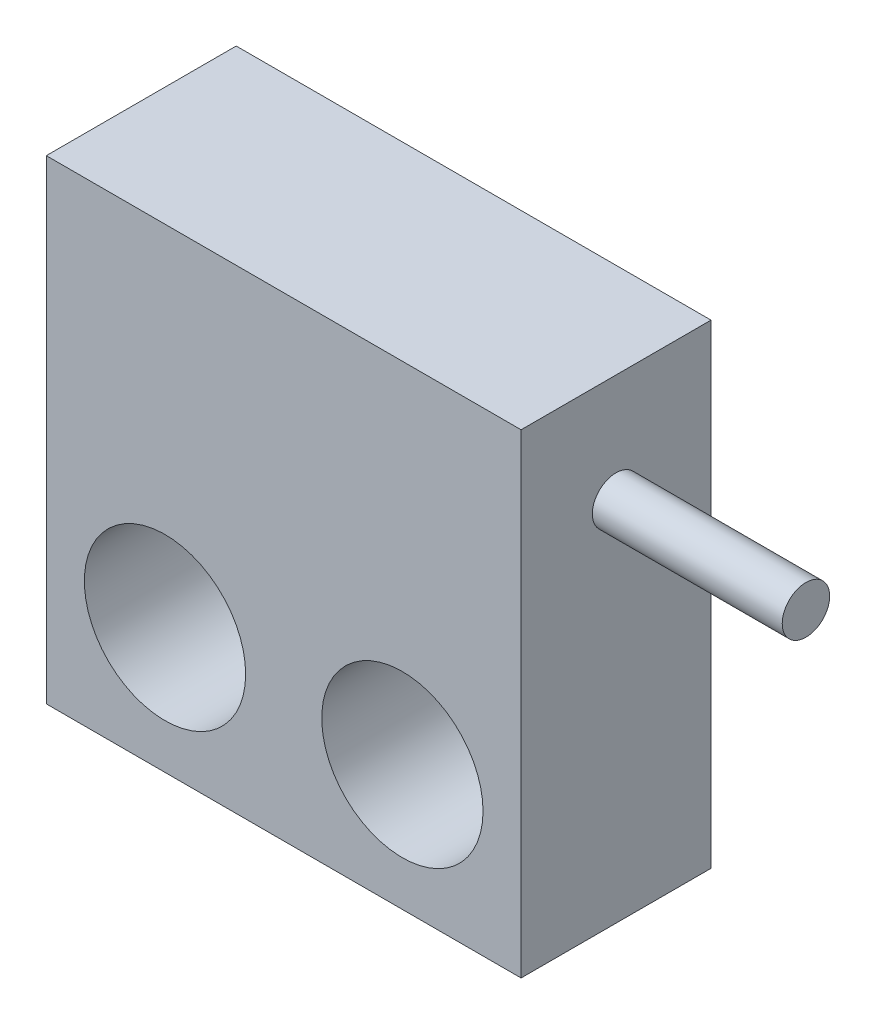
ISO-10303-21;
HEADER;
FILE_DESCRIPTION(('STEP AP214'),'2;1');
FILE_NAME('part.step','',(''),(''),'','','');
FILE_SCHEMA(('AUTOMOTIVE_DESIGN { 1 0 10303 214 1 1 1 1 }'));
ENDSEC;
DATA;
#1=APPLICATION_CONTEXT('core data for automotive mechanical design processes');
#2=APPLICATION_PROTOCOL_DEFINITION('international standard','automotive_design',2000,#1);
#3=PRODUCT_CONTEXT('',#1,'mechanical');
#4=PRODUCT('Part','Part','',(#3));
#5=PRODUCT_RELATED_PRODUCT_CATEGORY('part','',(#4));
#6=PRODUCT_DEFINITION_FORMATION('','',#4);
#7=PRODUCT_DEFINITION_CONTEXT('part definition',#1,'design');
#8=PRODUCT_DEFINITION('design','',#6,#7);
#9=PRODUCT_DEFINITION_SHAPE('','',#8);
#10=(LENGTH_UNIT() NAMED_UNIT(*) SI_UNIT(.MILLI.,.METRE.));
#11=(NAMED_UNIT(*) PLANE_ANGLE_UNIT() SI_UNIT($,.RADIAN.));
#12=(NAMED_UNIT(*) SI_UNIT($,.STERADIAN.) SOLID_ANGLE_UNIT());
#13=UNCERTAINTY_MEASURE_WITH_UNIT(LENGTH_MEASURE(1.E-05),#10,'distance_accuracy_value','');
#14=(GEOMETRIC_REPRESENTATION_CONTEXT(3) GLOBAL_UNCERTAINTY_ASSIGNED_CONTEXT((#13)) GLOBAL_UNIT_ASSIGNED_CONTEXT((#10,
#11,#12)) REPRESENTATION_CONTEXT('',''));
#15=CARTESIAN_POINT('',(0.,0.,0.));
#16=DIRECTION('',(0.,0.,1.));
#17=DIRECTION('',(1.,0.,0.));
#18=AXIS2_PLACEMENT_3D('',#15,#16,#17);
#19=CARTESIAN_POINT('',(0.,0.,20.));
#20=DIRECTION('',(0.,0.,-1.));
#21=DIRECTION('',(-1.,0.,0.));
#22=AXIS2_PLACEMENT_3D('',#19,#20,#21);
#23=PLANE('',#22);
#24=DIRECTION('',(0.,-1.,0.));
#25=VECTOR('',#24,1.);
#26=CARTESIAN_POINT('',(0.,0.,20.));
#27=LINE('',#26,#25);
#28=CARTESIAN_POINT('',(0.,50.,20.));
#29=VERTEX_POINT('',#28);
#30=CARTESIAN_POINT('',(0.,0.,20.));
#31=VERTEX_POINT('',#30);
#32=EDGE_CURVE('E90',#29,#31,#27,.T.);
#33=ORIENTED_EDGE('',*,*,#32,.T.);
#34=DIRECTION('',(1.,0.,0.));
#35=VECTOR('',#34,1.);
#36=CARTESIAN_POINT('',(0.,0.,20.));
#37=LINE('',#36,#35);
#38=CARTESIAN_POINT('',(50.,0.,20.));
#39=VERTEX_POINT('',#38);
#40=EDGE_CURVE('E85',#31,#39,#37,.T.);
#41=ORIENTED_EDGE('',*,*,#40,.T.);
#42=DIRECTION('',(0.,1.,0.));
#43=VECTOR('',#42,1.);
#44=CARTESIAN_POINT('',(50.,0.,20.));
#45=LINE('',#44,#43);
#46=CARTESIAN_POINT('',(50.,50.,20.));
#47=VERTEX_POINT('',#46);
#48=EDGE_CURVE('E88',#39,#47,#45,.T.);
#49=ORIENTED_EDGE('',*,*,#48,.T.);
#50=DIRECTION('',(-1.,0.,0.));
#51=VECTOR('',#50,1.);
#52=CARTESIAN_POINT('',(0.,50.,20.));
#53=LINE('',#52,#51);
#54=EDGE_CURVE('E54',#47,#29,#53,.T.);
#55=ORIENTED_EDGE('',*,*,#54,.T.);
#56=EDGE_LOOP('',(#33,#41,#49,#55));
#57=FACE_BOUND('',#56,.T.);
#58=CARTESIAN_POINT('',(12.5,13.2101831125864,20.));
#59=DIRECTION('',(0.,0.,1.));
#60=DIRECTION('',(1.,0.,0.));
#61=AXIS2_PLACEMENT_3D('',#58,#59,#60);
#62=CIRCLE('',#61,8.49319732259132);
#63=CARTESIAN_POINT('',(20.9931973225913,13.2101831125864,20.));
#64=VERTEX_POINT('',#63);
#65=EDGE_CURVE('E107',#64,#64,#62,.T.);
#66=ORIENTED_EDGE('',*,*,#65,.F.);
#67=EDGE_LOOP('',(#66));
#68=FACE_BOUND('',#67,.T.);
#69=CARTESIAN_POINT('',(37.5,13.2101831125864,20.));
#70=DIRECTION('',(0.,0.,1.));
#71=DIRECTION('',(1.,0.,0.));
#72=AXIS2_PLACEMENT_3D('',#69,#70,#71);
#73=CIRCLE('',#72,8.49319732259134);
#74=CARTESIAN_POINT('',(45.9931973225913,13.2101831125864,20.));
#75=VERTEX_POINT('',#74);
#76=EDGE_CURVE('E124',#75,#75,#73,.T.);
#77=ORIENTED_EDGE('',*,*,#76,.F.);
#78=EDGE_LOOP('',(#77));
#79=FACE_BOUND('',#78,.T.);
#80=ADVANCED_FACE('F37',(#57,#68,#79),#23,.F.);
#81=CARTESIAN_POINT('',(0.,0.,0.));
#82=DIRECTION('',(0.,0.,-1.));
#83=DIRECTION('',(-1.,0.,0.));
#84=AXIS2_PLACEMENT_3D('',#81,#82,#83);
#85=PLANE('',#84);
#86=CARTESIAN_POINT('',(12.5,13.2101831125864,0.));
#87=DIRECTION('',(0.,0.,1.));
#88=DIRECTION('',(1.,0.,0.));
#89=AXIS2_PLACEMENT_3D('',#86,#87,#88);
#90=CIRCLE('',#89,8.49319732259132);
#91=CARTESIAN_POINT('',(20.9931973225913,13.2101831125864,0.));
#92=VERTEX_POINT('',#91);
#93=EDGE_CURVE('E128',#92,#92,#90,.T.);
#94=ORIENTED_EDGE('',*,*,#93,.T.);
#95=EDGE_LOOP('',(#94));
#96=FACE_BOUND('',#95,.T.);
#97=DIRECTION('',(0.,-1.,0.));
#98=VECTOR('',#97,1.);
#99=CARTESIAN_POINT('',(0.,0.,0.));
#100=LINE('',#99,#98);
#101=CARTESIAN_POINT('',(0.,50.,0.));
#102=VERTEX_POINT('',#101);
#103=CARTESIAN_POINT('',(0.,0.,0.));
#104=VERTEX_POINT('',#103);
#105=EDGE_CURVE('E104',#102,#104,#100,.T.);
#106=ORIENTED_EDGE('',*,*,#105,.F.);
#107=DIRECTION('',(-1.,0.,0.));
#108=VECTOR('',#107,1.);
#109=CARTESIAN_POINT('',(0.,50.,0.));
#110=LINE('',#109,#108);
#111=CARTESIAN_POINT('',(50.,50.,0.));
#112=VERTEX_POINT('',#111);
#113=EDGE_CURVE('E77',#112,#102,#110,.T.);
#114=ORIENTED_EDGE('',*,*,#113,.F.);
#115=DIRECTION('',(0.,1.,0.));
#116=VECTOR('',#115,1.);
#117=CARTESIAN_POINT('',(50.,0.,0.));
#118=LINE('',#117,#116);
#119=CARTESIAN_POINT('',(50.,0.,0.));
#120=VERTEX_POINT('',#119);
#121=EDGE_CURVE('E71',#120,#112,#118,.T.);
#122=ORIENTED_EDGE('',*,*,#121,.F.);
#123=DIRECTION('',(1.,0.,0.));
#124=VECTOR('',#123,1.);
#125=CARTESIAN_POINT('',(0.,0.,0.));
#126=LINE('',#125,#124);
#127=EDGE_CURVE('E95',#104,#120,#126,.T.);
#128=ORIENTED_EDGE('',*,*,#127,.F.);
#129=EDGE_LOOP('',(#106,#114,#122,#128));
#130=FACE_BOUND('',#129,.T.);
#131=CARTESIAN_POINT('',(37.5,13.2101831125864,0.));
#132=DIRECTION('',(0.,0.,1.));
#133=DIRECTION('',(1.,0.,0.));
#134=AXIS2_PLACEMENT_3D('',#131,#132,#133);
#135=CIRCLE('',#134,8.49319732259134);
#136=CARTESIAN_POINT('',(45.9931973225913,13.2101831125864,0.));
#137=VERTEX_POINT('',#136);
#138=EDGE_CURVE('E122',#137,#137,#135,.T.);
#139=ORIENTED_EDGE('',*,*,#138,.T.);
#140=EDGE_LOOP('',(#139));
#141=FACE_BOUND('',#140,.T.);
#142=ADVANCED_FACE('F115',(#96,#130,#141),#85,.T.);
#143=CARTESIAN_POINT('',(0.,0.,20.));
#144=DIRECTION('',(1.,0.,0.));
#145=DIRECTION('',(0.,0.,-1.));
#146=AXIS2_PLACEMENT_3D('',#143,#144,#145);
#147=PLANE('',#146);
#148=ORIENTED_EDGE('',*,*,#105,.T.);
#149=DIRECTION('',(0.,0.,-1.));
#150=VECTOR('',#149,1.);
#151=CARTESIAN_POINT('',(0.,0.,20.));
#152=LINE('',#151,#150);
#153=EDGE_CURVE('E46',#31,#104,#152,.T.);
#154=ORIENTED_EDGE('',*,*,#153,.F.);
#155=ORIENTED_EDGE('',*,*,#32,.F.);
#156=DIRECTION('',(0.,0.,-1.));
#157=VECTOR('',#156,1.);
#158=CARTESIAN_POINT('',(0.,50.,20.));
#159=LINE('',#158,#157);
#160=EDGE_CURVE('E100',#29,#102,#159,.T.);
#161=ORIENTED_EDGE('',*,*,#160,.T.);
#162=EDGE_LOOP('',(#148,#154,#155,#161));
#163=FACE_BOUND('',#162,.T.);
#164=ADVANCED_FACE('F39',(#163),#147,.F.);
#165=CARTESIAN_POINT('',(0.,0.,20.));
#166=DIRECTION('',(0.,1.,0.));
#167=DIRECTION('',(0.,0.,1.));
#168=AXIS2_PLACEMENT_3D('',#165,#166,#167);
#169=PLANE('',#168);
#170=ORIENTED_EDGE('',*,*,#127,.T.);
#171=DIRECTION('',(0.,0.,-1.));
#172=VECTOR('',#171,1.);
#173=CARTESIAN_POINT('',(50.,0.,20.));
#174=LINE('',#173,#172);
#175=EDGE_CURVE('E93',#39,#120,#174,.T.);
#176=ORIENTED_EDGE('',*,*,#175,.F.);
#177=ORIENTED_EDGE('',*,*,#40,.F.);
#178=ORIENTED_EDGE('',*,*,#153,.T.);
#179=EDGE_LOOP('',(#170,#176,#177,#178));
#180=FACE_BOUND('',#179,.T.);
#181=ADVANCED_FACE('F94',(#180),#169,.F.);
#182=CARTESIAN_POINT('',(50.,0.,20.));
#183=DIRECTION('',(-1.,0.,0.));
#184=DIRECTION('',(0.,0.,1.));
#185=AXIS2_PLACEMENT_3D('',#182,#183,#184);
#186=PLANE('',#185);
#187=CARTESIAN_POINT('',(50.,38.5779585069408,10.));
#188=DIRECTION('',(-1.,0.,0.));
#189=DIRECTION('',(0.,0.,1.));
#190=AXIS2_PLACEMENT_3D('',#187,#188,#189);
#191=CIRCLE('',#190,2.5);
#192=CARTESIAN_POINT('',(50.,38.5779585069408,12.5));
#193=VERTEX_POINT('',#192);
#194=EDGE_CURVE('E11',#193,#193,#191,.F.);
#195=ORIENTED_EDGE('',*,*,#194,.F.);
#196=EDGE_LOOP('',(#195));
#197=FACE_BOUND('',#196,.T.);
#198=ORIENTED_EDGE('',*,*,#121,.T.);
#199=DIRECTION('',(0.,0.,-1.));
#200=VECTOR('',#199,1.);
#201=CARTESIAN_POINT('',(50.,50.,20.));
#202=LINE('',#201,#200);
#203=EDGE_CURVE('E96',#47,#112,#202,.T.);
#204=ORIENTED_EDGE('',*,*,#203,.F.);
#205=ORIENTED_EDGE('',*,*,#48,.F.);
#206=ORIENTED_EDGE('',*,*,#175,.T.);
#207=EDGE_LOOP('',(#198,#204,#205,#206));
#208=FACE_BOUND('',#207,.T.);
#209=ADVANCED_FACE('F98',(#197,#208),#186,.F.);
#210=CARTESIAN_POINT('',(0.,50.,20.));
#211=DIRECTION('',(0.,-1.,0.));
#212=DIRECTION('',(0.,0.,-1.));
#213=AXIS2_PLACEMENT_3D('',#210,#211,#212);
#214=PLANE('',#213);
#215=ORIENTED_EDGE('',*,*,#113,.T.);
#216=ORIENTED_EDGE('',*,*,#160,.F.);
#217=ORIENTED_EDGE('',*,*,#54,.F.);
#218=ORIENTED_EDGE('',*,*,#203,.T.);
#219=EDGE_LOOP('',(#215,#216,#217,#218));
#220=FACE_BOUND('',#219,.T.);
#221=ADVANCED_FACE('F141',(#220),#214,.F.);
#222=CARTESIAN_POINT('',(12.5,13.2101831125864,20.));
#223=DIRECTION('',(0.,0.,-1.));
#224=DIRECTION('',(-1.,0.,0.));
#225=AXIS2_PLACEMENT_3D('',#222,#223,#224);
#226=CYLINDRICAL_SURFACE('',#225,8.49319732259132);
#227=ORIENTED_EDGE('',*,*,#65,.T.);
#228=EDGE_LOOP('',(#227));
#229=FACE_BOUND('',#228,.T.);
#230=ORIENTED_EDGE('',*,*,#93,.F.);
#231=EDGE_LOOP('',(#230));
#232=FACE_BOUND('',#231,.T.);
#233=ADVANCED_FACE('F138',(#229,#232),#226,.F.);
#234=CARTESIAN_POINT('',(37.5,13.2101831125864,20.));
#235=DIRECTION('',(0.,0.,-1.));
#236=DIRECTION('',(-1.,0.,0.));
#237=AXIS2_PLACEMENT_3D('',#234,#235,#236);
#238=CYLINDRICAL_SURFACE('',#237,8.49319732259134);
#239=ORIENTED_EDGE('',*,*,#76,.T.);
#240=EDGE_LOOP('',(#239));
#241=FACE_BOUND('',#240,.T.);
#242=ORIENTED_EDGE('',*,*,#138,.F.);
#243=EDGE_LOOP('',(#242));
#244=FACE_BOUND('',#243,.T.);
#245=ADVANCED_FACE('F140',(#241,#244),#238,.F.);
#246=CARTESIAN_POINT('',(70.,38.5779585069408,10.));
#247=DIRECTION('',(-1.,0.,0.));
#248=DIRECTION('',(0.,0.,1.));
#249=AXIS2_PLACEMENT_3D('',#246,#247,#248);
#250=CYLINDRICAL_SURFACE('',#249,2.5);
#251=CARTESIAN_POINT('',(70.,38.5779585069408,10.));
#252=DIRECTION('',(1.,0.,0.));
#253=DIRECTION('',(0.,0.,-1.));
#254=AXIS2_PLACEMENT_3D('',#251,#252,#253);
#255=CIRCLE('',#254,2.5);
#256=CARTESIAN_POINT('',(70.,38.5779585069408,7.5));
#257=VERTEX_POINT('',#256);
#258=EDGE_CURVE('E125',#257,#257,#255,.T.);
#259=ORIENTED_EDGE('',*,*,#258,.F.);
#260=EDGE_LOOP('',(#259));
#261=FACE_BOUND('',#260,.T.);
#262=ORIENTED_EDGE('',*,*,#194,.T.);
#263=EDGE_LOOP('',(#262));
#264=FACE_BOUND('',#263,.T.);
#265=ADVANCED_FACE('F148',(#261,#264),#250,.T.);
#266=CARTESIAN_POINT('',(70.,38.5779585069408,10.));
#267=DIRECTION('',(1.,0.,0.));
#268=DIRECTION('',(0.,0.,-1.));
#269=AXIS2_PLACEMENT_3D('',#266,#267,#268);
#270=PLANE('',#269);
#271=ORIENTED_EDGE('',*,*,#258,.T.);
#272=EDGE_LOOP('',(#271));
#273=FACE_BOUND('',#272,.T.);
#274=ADVANCED_FACE('F208',(#273),#270,.T.);
#275=CLOSED_SHELL('',(#80,#142,#164,#181,#209,#221,#233,#245,#265,#274));
#276=MANIFOLD_SOLID_BREP('B2',#275);
#277=ADVANCED_BREP_SHAPE_REPRESENTATION('',(#18,#276),#14);
#278=SHAPE_DEFINITION_REPRESENTATION(#9,#277);
ENDSEC;
END-ISO-10303-21;
